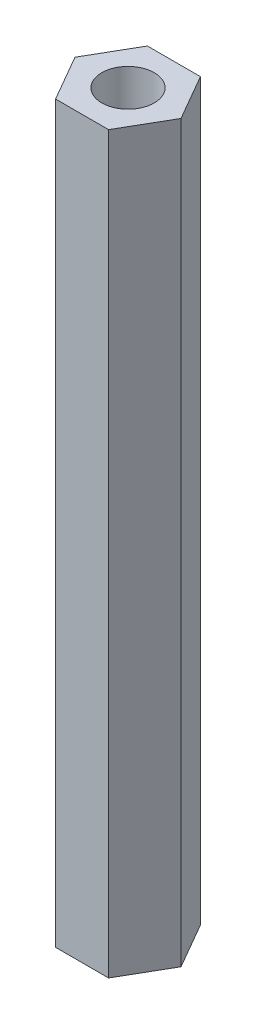
ISO-10303-21;
HEADER;
FILE_DESCRIPTION(('STEP AP214'),'2;1');
FILE_NAME('part.step','',(''),(''),'','','');
FILE_SCHEMA(('AUTOMOTIVE_DESIGN { 1 0 10303 214 1 1 1 1 }'));
ENDSEC;
DATA;
#1=APPLICATION_CONTEXT('core data for automotive mechanical design processes');
#2=APPLICATION_PROTOCOL_DEFINITION('international standard','automotive_design',2000,#1);
#3=PRODUCT_CONTEXT('',#1,'mechanical');
#4=PRODUCT('Part','Part','',(#3));
#5=PRODUCT_RELATED_PRODUCT_CATEGORY('part','',(#4));
#6=PRODUCT_DEFINITION_FORMATION('','',#4);
#7=PRODUCT_DEFINITION_CONTEXT('part definition',#1,'design');
#8=PRODUCT_DEFINITION('design','',#6,#7);
#9=PRODUCT_DEFINITION_SHAPE('','',#8);
#10=(LENGTH_UNIT() NAMED_UNIT(*) SI_UNIT(.MILLI.,.METRE.));
#11=(NAMED_UNIT(*) PLANE_ANGLE_UNIT() SI_UNIT($,.RADIAN.));
#12=(NAMED_UNIT(*) SI_UNIT($,.STERADIAN.) SOLID_ANGLE_UNIT());
#13=UNCERTAINTY_MEASURE_WITH_UNIT(LENGTH_MEASURE(1.E-05),#10,'distance_accuracy_value','');
#14=(GEOMETRIC_REPRESENTATION_CONTEXT(3) GLOBAL_UNCERTAINTY_ASSIGNED_CONTEXT((#13)) GLOBAL_UNIT_ASSIGNED_CONTEXT((#10,
#11,#12)) REPRESENTATION_CONTEXT('',''));
#15=CARTESIAN_POINT('',(0.,0.,0.));
#16=DIRECTION('',(0.,0.,1.));
#17=DIRECTION('',(1.,0.,0.));
#18=AXIS2_PLACEMENT_3D('',#15,#16,#17);
#19=CARTESIAN_POINT('',(0.,56.,0.));
#20=DIRECTION('',(0.,1.,0.));
#21=DIRECTION('',(0.,0.,1.));
#22=AXIS2_PLACEMENT_3D('',#19,#20,#21);
#23=PLANE('',#22);
#24=DIRECTION('',(-0.5,0.,-0.866025403784438));
#25=VECTOR('',#24,1.);
#26=CARTESIAN_POINT('',(4.04145188432738,56.,0.));
#27=LINE('',#26,#25);
#28=CARTESIAN_POINT('',(4.04145188432738,56.,0.));
#29=VERTEX_POINT('',#28);
#30=CARTESIAN_POINT('',(2.02072594216369,56.,-3.5));
#31=VERTEX_POINT('',#30);
#32=EDGE_CURVE('E139',#29,#31,#27,.T.);
#33=ORIENTED_EDGE('',*,*,#32,.T.);
#34=DIRECTION('',(-1.,0.,0.));
#35=VECTOR('',#34,1.);
#36=CARTESIAN_POINT('',(2.02072594216369,56.,-3.5));
#37=LINE('',#36,#35);
#38=CARTESIAN_POINT('',(-2.02072594216369,56.,-3.5));
#39=VERTEX_POINT('',#38);
#40=EDGE_CURVE('E97',#31,#39,#37,.T.);
#41=ORIENTED_EDGE('',*,*,#40,.T.);
#42=DIRECTION('',(-0.5,0.,0.866025403784439));
#43=VECTOR('',#42,1.);
#44=CARTESIAN_POINT('',(-2.02072594216369,56.,-3.5));
#45=LINE('',#44,#43);
#46=CARTESIAN_POINT('',(-4.04145188432738,56.,0.));
#47=VERTEX_POINT('',#46);
#48=EDGE_CURVE('E110',#39,#47,#45,.T.);
#49=ORIENTED_EDGE('',*,*,#48,.T.);
#50=DIRECTION('',(0.5,0.,0.866025403784438));
#51=VECTOR('',#50,1.);
#52=CARTESIAN_POINT('',(-4.04145188432738,56.,0.));
#53=LINE('',#52,#51);
#54=CARTESIAN_POINT('',(-2.02072594216369,56.,3.5));
#55=VERTEX_POINT('',#54);
#56=EDGE_CURVE('E104',#47,#55,#53,.T.);
#57=ORIENTED_EDGE('',*,*,#56,.T.);
#58=DIRECTION('',(1.,0.,0.));
#59=VECTOR('',#58,1.);
#60=CARTESIAN_POINT('',(-2.02072594216369,56.,3.5));
#61=LINE('',#60,#59);
#62=CARTESIAN_POINT('',(2.02072594216369,56.,3.5));
#63=VERTEX_POINT('',#62);
#64=EDGE_CURVE('E108',#55,#63,#61,.T.);
#65=ORIENTED_EDGE('',*,*,#64,.T.);
#66=DIRECTION('',(0.5,0.,-0.866025403784439));
#67=VECTOR('',#66,1.);
#68=CARTESIAN_POINT('',(2.02072594216369,56.,3.5));
#69=LINE('',#68,#67);
#70=EDGE_CURVE('E60',#63,#29,#69,.T.);
#71=ORIENTED_EDGE('',*,*,#70,.T.);
#72=EDGE_LOOP('',(#33,#41,#49,#57,#65,#71));
#73=FACE_BOUND('',#72,.T.);
#74=CARTESIAN_POINT('',(0.,56.,0.));
#75=DIRECTION('',(0.,1.,0.));
#76=DIRECTION('',(0.,0.,1.));
#77=AXIS2_PLACEMENT_3D('',#74,#75,#76);
#78=CIRCLE('',#77,2.);
#79=CARTESIAN_POINT('',(0.,56.,2.));
#80=VERTEX_POINT('',#79);
#81=EDGE_CURVE('E132',#80,#80,#78,.T.);
#82=ORIENTED_EDGE('',*,*,#81,.F.);
#83=EDGE_LOOP('',(#82));
#84=FACE_BOUND('',#83,.T.);
#85=ADVANCED_FACE('F43',(#73,#84),#23,.T.);
#86=CARTESIAN_POINT('',(0.,0.,0.));
#87=DIRECTION('',(0.,1.,0.));
#88=DIRECTION('',(0.,0.,1.));
#89=AXIS2_PLACEMENT_3D('',#86,#87,#88);
#90=PLANE('',#89);
#91=DIRECTION('',(-0.5,0.,-0.866025403784438));
#92=VECTOR('',#91,1.);
#93=CARTESIAN_POINT('',(4.04145188432738,0.,0.));
#94=LINE('',#93,#92);
#95=CARTESIAN_POINT('',(4.04145188432738,0.,0.));
#96=VERTEX_POINT('',#95);
#97=CARTESIAN_POINT('',(2.02072594216369,0.,-3.5));
#98=VERTEX_POINT('',#97);
#99=EDGE_CURVE('E128',#96,#98,#94,.T.);
#100=ORIENTED_EDGE('',*,*,#99,.F.);
#101=DIRECTION('',(0.5,0.,-0.866025403784439));
#102=VECTOR('',#101,1.);
#103=CARTESIAN_POINT('',(2.02072594216369,0.,3.5));
#104=LINE('',#103,#102);
#105=CARTESIAN_POINT('',(2.02072594216369,0.,3.5));
#106=VERTEX_POINT('',#105);
#107=EDGE_CURVE('E89',#106,#96,#104,.T.);
#108=ORIENTED_EDGE('',*,*,#107,.F.);
#109=DIRECTION('',(1.,0.,0.));
#110=VECTOR('',#109,1.);
#111=CARTESIAN_POINT('',(-2.02072594216369,0.,3.5));
#112=LINE('',#111,#110);
#113=CARTESIAN_POINT('',(-2.02072594216369,0.,3.5));
#114=VERTEX_POINT('',#113);
#115=EDGE_CURVE('E83',#114,#106,#112,.T.);
#116=ORIENTED_EDGE('',*,*,#115,.F.);
#117=DIRECTION('',(0.5,0.,0.866025403784438));
#118=VECTOR('',#117,1.);
#119=CARTESIAN_POINT('',(-4.04145188432738,0.,0.));
#120=LINE('',#119,#118);
#121=CARTESIAN_POINT('',(-4.04145188432738,0.,0.));
#122=VERTEX_POINT('',#121);
#123=EDGE_CURVE('E118',#122,#114,#120,.T.);
#124=ORIENTED_EDGE('',*,*,#123,.F.);
#125=DIRECTION('',(-0.5,0.,0.866025403784439));
#126=VECTOR('',#125,1.);
#127=CARTESIAN_POINT('',(-2.02072594216369,0.,-3.5));
#128=LINE('',#127,#126);
#129=CARTESIAN_POINT('',(-2.02072594216369,0.,-3.5));
#130=VERTEX_POINT('',#129);
#131=EDGE_CURVE('E134',#130,#122,#128,.T.);
#132=ORIENTED_EDGE('',*,*,#131,.F.);
#133=DIRECTION('',(-1.,0.,0.));
#134=VECTOR('',#133,1.);
#135=CARTESIAN_POINT('',(2.02072594216369,0.,-3.5));
#136=LINE('',#135,#134);
#137=EDGE_CURVE('E131',#98,#130,#136,.T.);
#138=ORIENTED_EDGE('',*,*,#137,.F.);
#139=EDGE_LOOP('',(#100,#108,#116,#124,#132,#138));
#140=FACE_BOUND('',#139,.T.);
#141=CARTESIAN_POINT('',(0.,0.,0.));
#142=DIRECTION('',(0.,1.,0.));
#143=DIRECTION('',(0.,0.,1.));
#144=AXIS2_PLACEMENT_3D('',#141,#142,#143);
#145=CIRCLE('',#144,2.);
#146=CARTESIAN_POINT('',(0.,0.,2.));
#147=VERTEX_POINT('',#146);
#148=EDGE_CURVE('E256',#147,#147,#145,.T.);
#149=ORIENTED_EDGE('',*,*,#148,.T.);
#150=EDGE_LOOP('',(#149));
#151=FACE_BOUND('',#150,.T.);
#152=ADVANCED_FACE('F148',(#140,#151),#90,.F.);
#153=CARTESIAN_POINT('',(4.04145188432738,56.,0.));
#154=DIRECTION('',(-0.866025403784438,0.,0.5));
#155=DIRECTION('',(0.5,0.,0.866025403784439));
#156=AXIS2_PLACEMENT_3D('',#153,#154,#155);
#157=PLANE('',#156);
#158=ORIENTED_EDGE('',*,*,#99,.T.);
#159=DIRECTION('',(0.,-1.,0.));
#160=VECTOR('',#159,1.);
#161=CARTESIAN_POINT('',(2.02072594216369,56.,-3.5));
#162=LINE('',#161,#160);
#163=EDGE_CURVE('E11',#31,#98,#162,.T.);
#164=ORIENTED_EDGE('',*,*,#163,.F.);
#165=ORIENTED_EDGE('',*,*,#32,.F.);
#166=DIRECTION('',(0.,-1.,0.));
#167=VECTOR('',#166,1.);
#168=CARTESIAN_POINT('',(4.04145188432738,56.,0.));
#169=LINE('',#168,#167);
#170=EDGE_CURVE('E124',#29,#96,#169,.T.);
#171=ORIENTED_EDGE('',*,*,#170,.T.);
#172=EDGE_LOOP('',(#158,#164,#165,#171));
#173=FACE_BOUND('',#172,.T.);
#174=ADVANCED_FACE('F45',(#173),#157,.F.);
#175=CARTESIAN_POINT('',(2.02072594216369,56.,-3.5));
#176=DIRECTION('',(0.,0.,1.));
#177=DIRECTION('',(1.,0.,0.));
#178=AXIS2_PLACEMENT_3D('',#175,#176,#177);
#179=PLANE('',#178);
#180=ORIENTED_EDGE('',*,*,#137,.T.);
#181=DIRECTION('',(0.,-1.,0.));
#182=VECTOR('',#181,1.);
#183=CARTESIAN_POINT('',(-2.02072594216369,56.,-3.5));
#184=LINE('',#183,#182);
#185=EDGE_CURVE('E52',#39,#130,#184,.T.);
#186=ORIENTED_EDGE('',*,*,#185,.F.);
#187=ORIENTED_EDGE('',*,*,#40,.F.);
#188=ORIENTED_EDGE('',*,*,#163,.T.);
#189=EDGE_LOOP('',(#180,#186,#187,#188));
#190=FACE_BOUND('',#189,.T.);
#191=ADVANCED_FACE('F174',(#190),#179,.F.);
#192=CARTESIAN_POINT('',(-2.02072594216369,56.,-3.5));
#193=DIRECTION('',(0.866025403784439,0.,0.5));
#194=DIRECTION('',(0.5,0.,-0.866025403784439));
#195=AXIS2_PLACEMENT_3D('',#192,#193,#194);
#196=PLANE('',#195);
#197=ORIENTED_EDGE('',*,*,#131,.T.);
#198=DIRECTION('',(0.,-1.,0.));
#199=VECTOR('',#198,1.);
#200=CARTESIAN_POINT('',(-4.04145188432738,56.,0.));
#201=LINE('',#200,#199);
#202=EDGE_CURVE('E119',#47,#122,#201,.T.);
#203=ORIENTED_EDGE('',*,*,#202,.F.);
#204=ORIENTED_EDGE('',*,*,#48,.F.);
#205=ORIENTED_EDGE('',*,*,#185,.T.);
#206=EDGE_LOOP('',(#197,#203,#204,#205));
#207=FACE_BOUND('',#206,.T.);
#208=ADVANCED_FACE('F145',(#207),#196,.F.);
#209=CARTESIAN_POINT('',(-4.04145188432738,56.,0.));
#210=DIRECTION('',(0.866025403784438,0.,-0.5));
#211=DIRECTION('',(-0.5,0.,-0.866025403784438));
#212=AXIS2_PLACEMENT_3D('',#209,#210,#211);
#213=PLANE('',#212);
#214=ORIENTED_EDGE('',*,*,#123,.T.);
#215=DIRECTION('',(0.,-1.,0.));
#216=VECTOR('',#215,1.);
#217=CARTESIAN_POINT('',(-2.02072594216369,56.,3.5));
#218=LINE('',#217,#216);
#219=EDGE_CURVE('E115',#55,#114,#218,.T.);
#220=ORIENTED_EDGE('',*,*,#219,.F.);
#221=ORIENTED_EDGE('',*,*,#56,.F.);
#222=ORIENTED_EDGE('',*,*,#202,.T.);
#223=EDGE_LOOP('',(#214,#220,#221,#222));
#224=FACE_BOUND('',#223,.T.);
#225=ADVANCED_FACE('F116',(#224),#213,.F.);
#226=CARTESIAN_POINT('',(-2.02072594216369,56.,3.5));
#227=DIRECTION('',(0.,0.,-1.));
#228=DIRECTION('',(-1.,0.,0.));
#229=AXIS2_PLACEMENT_3D('',#226,#227,#228);
#230=PLANE('',#229);
#231=ORIENTED_EDGE('',*,*,#115,.T.);
#232=DIRECTION('',(0.,-1.,0.));
#233=VECTOR('',#232,1.);
#234=CARTESIAN_POINT('',(2.02072594216369,56.,3.5));
#235=LINE('',#234,#233);
#236=EDGE_CURVE('E120',#63,#106,#235,.T.);
#237=ORIENTED_EDGE('',*,*,#236,.F.);
#238=ORIENTED_EDGE('',*,*,#64,.F.);
#239=ORIENTED_EDGE('',*,*,#219,.T.);
#240=EDGE_LOOP('',(#231,#237,#238,#239));
#241=FACE_BOUND('',#240,.T.);
#242=ADVANCED_FACE('F122',(#241),#230,.F.);
#243=CARTESIAN_POINT('',(2.02072594216369,56.,3.5));
#244=DIRECTION('',(-0.866025403784439,0.,-0.5));
#245=DIRECTION('',(-0.5,0.,0.866025403784439));
#246=AXIS2_PLACEMENT_3D('',#243,#244,#245);
#247=PLANE('',#246);
#248=ORIENTED_EDGE('',*,*,#107,.T.);
#249=ORIENTED_EDGE('',*,*,#170,.F.);
#250=ORIENTED_EDGE('',*,*,#70,.F.);
#251=ORIENTED_EDGE('',*,*,#236,.T.);
#252=EDGE_LOOP('',(#248,#249,#250,#251));
#253=FACE_BOUND('',#252,.T.);
#254=ADVANCED_FACE('F153',(#253),#247,.F.);
#255=CARTESIAN_POINT('',(0.,56.,0.));
#256=DIRECTION('',(0.,-1.,0.));
#257=DIRECTION('',(0.,0.,-1.));
#258=AXIS2_PLACEMENT_3D('',#255,#256,#257);
#259=CYLINDRICAL_SURFACE('',#258,2.);
#260=ORIENTED_EDGE('',*,*,#81,.T.);
#261=EDGE_LOOP('',(#260));
#262=FACE_BOUND('',#261,.T.);
#263=ORIENTED_EDGE('',*,*,#148,.F.);
#264=EDGE_LOOP('',(#263));
#265=FACE_BOUND('',#264,.T.);
#266=ADVANCED_FACE('F155',(#262,#265),#259,.F.);
#267=CLOSED_SHELL('',(#85,#152,#174,#191,#208,#225,#242,#254,#266));
#268=MANIFOLD_SOLID_BREP('B2',#267);
#269=ADVANCED_BREP_SHAPE_REPRESENTATION('',(#18,#268),#14);
#270=SHAPE_DEFINITION_REPRESENTATION(#9,#269);
ENDSEC;
END-ISO-10303-21;
